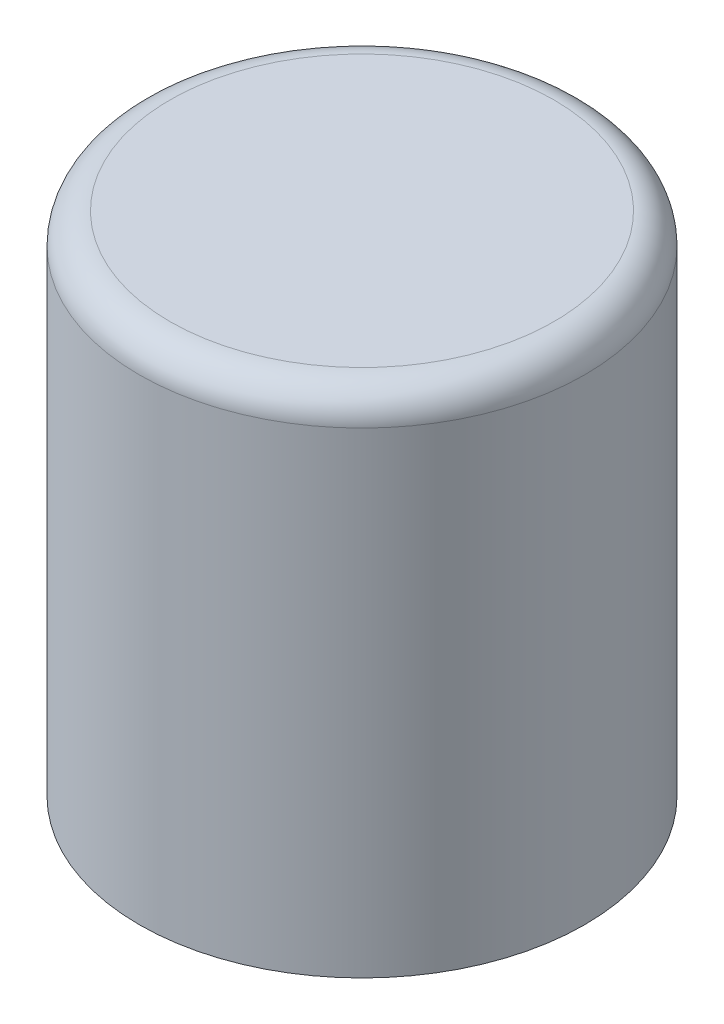
ISO-10303-21;
HEADER;
FILE_DESCRIPTION(('STEP AP214'),'2;1');
FILE_NAME('part.step','',(''),(''),'','','');
FILE_SCHEMA(('AUTOMOTIVE_DESIGN { 1 0 10303 214 1 1 1 1 }'));
ENDSEC;
DATA;
#1=APPLICATION_CONTEXT('core data for automotive mechanical design processes');
#2=APPLICATION_PROTOCOL_DEFINITION('international standard','automotive_design',2000,#1);
#3=PRODUCT_CONTEXT('',#1,'mechanical');
#4=PRODUCT('Part','Part','',(#3));
#5=PRODUCT_RELATED_PRODUCT_CATEGORY('part','',(#4));
#6=PRODUCT_DEFINITION_FORMATION('','',#4);
#7=PRODUCT_DEFINITION_CONTEXT('part definition',#1,'design');
#8=PRODUCT_DEFINITION('design','',#6,#7);
#9=PRODUCT_DEFINITION_SHAPE('','',#8);
#10=(LENGTH_UNIT() NAMED_UNIT(*) SI_UNIT(.MILLI.,.METRE.));
#11=(NAMED_UNIT(*) PLANE_ANGLE_UNIT() SI_UNIT($,.RADIAN.));
#12=(NAMED_UNIT(*) SI_UNIT($,.STERADIAN.) SOLID_ANGLE_UNIT());
#13=UNCERTAINTY_MEASURE_WITH_UNIT(LENGTH_MEASURE(1.E-05),#10,'distance_accuracy_value','');
#14=(GEOMETRIC_REPRESENTATION_CONTEXT(3) GLOBAL_UNCERTAINTY_ASSIGNED_CONTEXT((#13)) GLOBAL_UNIT_ASSIGNED_CONTEXT((#10,
#11,#12)) REPRESENTATION_CONTEXT('',''));
#15=CARTESIAN_POINT('',(0.,0.,0.));
#16=DIRECTION('',(0.,0.,1.));
#17=DIRECTION('',(1.,0.,0.));
#18=AXIS2_PLACEMENT_3D('',#15,#16,#17);
#19=CARTESIAN_POINT('',(0.,0.,0.));
#20=DIRECTION('',(0.,1.,0.));
#21=DIRECTION('',(0.,0.,1.));
#22=AXIS2_PLACEMENT_3D('',#19,#20,#21);
#23=PLANE('',#22);
#24=CARTESIAN_POINT('',(0.,0.,0.));
#25=DIRECTION('',(0.,1.,0.));
#26=DIRECTION('',(0.,0.,1.));
#27=AXIS2_PLACEMENT_3D('',#24,#25,#26);
#28=CIRCLE('',#27,7.25);
#29=CARTESIAN_POINT('',(0.,0.,7.25));
#30=VERTEX_POINT('',#29);
#31=EDGE_CURVE('E46',#30,#30,#28,.T.);
#32=ORIENTED_EDGE('',*,*,#31,.F.);
#33=EDGE_LOOP('',(#32));
#34=FACE_BOUND('',#33,.T.);
#35=CARTESIAN_POINT('',(0.,0.,0.));
#36=DIRECTION('',(0.,1.,0.));
#37=DIRECTION('',(0.,0.,1.));
#38=AXIS2_PLACEMENT_3D('',#35,#36,#37);
#39=CIRCLE('',#38,3.);
#40=CARTESIAN_POINT('',(0.,0.,3.));
#41=VERTEX_POINT('',#40);
#42=EDGE_CURVE('E10',#41,#41,#39,.F.);
#43=ORIENTED_EDGE('',*,*,#42,.F.);
#44=EDGE_LOOP('',(#43));
#45=FACE_BOUND('',#44,.T.);
#46=ADVANCED_FACE('F31',(#34,#45),#23,.F.);
#47=CARTESIAN_POINT('',(0.,16.5,0.));
#48=DIRECTION('',(0.,-1.,0.));
#49=DIRECTION('',(0.,0.,-1.));
#50=AXIS2_PLACEMENT_3D('',#47,#48,#49);
#51=CYLINDRICAL_SURFACE('',#50,7.25);
#52=CARTESIAN_POINT('',(0.,15.5,0.));
#53=DIRECTION('',(0.,1.,0.));
#54=DIRECTION('',(0.,0.,1.));
#55=AXIS2_PLACEMENT_3D('',#52,#53,#54);
#56=CIRCLE('',#55,7.25);
#57=CARTESIAN_POINT('',(0.,15.5,7.25));
#58=VERTEX_POINT('',#57);
#59=EDGE_CURVE('E38',#58,#58,#56,.F.);
#60=ORIENTED_EDGE('',*,*,#59,.T.);
#61=EDGE_LOOP('',(#60));
#62=FACE_BOUND('',#61,.T.);
#63=ORIENTED_EDGE('',*,*,#31,.T.);
#64=EDGE_LOOP('',(#63));
#65=FACE_BOUND('',#64,.T.);
#66=ADVANCED_FACE('F85',(#62,#65),#51,.T.);
#67=CARTESIAN_POINT('',(0.,16.5,0.));
#68=DIRECTION('',(0.,1.,0.));
#69=DIRECTION('',(0.,0.,1.));
#70=AXIS2_PLACEMENT_3D('',#67,#68,#69);
#71=PLANE('',#70);
#72=CARTESIAN_POINT('',(0.,16.5,0.));
#73=DIRECTION('',(0.,1.,0.));
#74=DIRECTION('',(0.,0.,1.));
#75=AXIS2_PLACEMENT_3D('',#72,#73,#74);
#76=CIRCLE('',#75,6.25);
#77=CARTESIAN_POINT('',(0.,16.5,6.25));
#78=VERTEX_POINT('',#77);
#79=EDGE_CURVE('E42',#78,#78,#76,.T.);
#80=ORIENTED_EDGE('',*,*,#79,.T.);
#81=EDGE_LOOP('',(#80));
#82=FACE_BOUND('',#81,.T.);
#83=ADVANCED_FACE('F81',(#82),#71,.T.);
#84=CARTESIAN_POINT('',(0.,15.5,0.));
#85=DIRECTION('',(0.,1.,0.));
#86=DIRECTION('',(0.,0.,1.));
#87=AXIS2_PLACEMENT_3D('',#84,#85,#86);
#88=TOROIDAL_SURFACE('',#87,6.25,1.);
#89=ORIENTED_EDGE('',*,*,#59,.F.);
#90=EDGE_LOOP('',(#89));
#91=FACE_BOUND('',#90,.T.);
#92=ORIENTED_EDGE('',*,*,#79,.F.);
#93=EDGE_LOOP('',(#92));
#94=FACE_BOUND('',#93,.T.);
#95=ADVANCED_FACE('F33',(#91,#94),#88,.T.);
#96=CARTESIAN_POINT('',(0.,-1.,0.));
#97=DIRECTION('',(0.,1.,0.));
#98=DIRECTION('',(0.,0.,1.));
#99=AXIS2_PLACEMENT_3D('',#96,#97,#98);
#100=CYLINDRICAL_SURFACE('',#99,3.);
#101=CARTESIAN_POINT('',(0.,-1.,0.));
#102=DIRECTION('',(0.,-1.,0.));
#103=DIRECTION('',(0.,0.,-1.));
#104=AXIS2_PLACEMENT_3D('',#101,#102,#103);
#105=CIRCLE('',#104,3.);
#106=CARTESIAN_POINT('',(0.,-1.,-3.));
#107=VERTEX_POINT('',#106);
#108=EDGE_CURVE('E51',#107,#107,#105,.T.);
#109=ORIENTED_EDGE('',*,*,#108,.F.);
#110=EDGE_LOOP('',(#109));
#111=FACE_BOUND('',#110,.T.);
#112=ORIENTED_EDGE('',*,*,#42,.T.);
#113=EDGE_LOOP('',(#112));
#114=FACE_BOUND('',#113,.T.);
#115=ADVANCED_FACE('F72',(#111,#114),#100,.T.);
#116=CARTESIAN_POINT('',(0.,-1.,0.));
#117=DIRECTION('',(0.,-1.,0.));
#118=DIRECTION('',(0.,0.,-1.));
#119=AXIS2_PLACEMENT_3D('',#116,#117,#118);
#120=PLANE('',#119);
#121=CARTESIAN_POINT('',(0.,-1.,0.));
#122=DIRECTION('',(0.,-1.,0.));
#123=DIRECTION('',(0.,0.,-1.));
#124=AXIS2_PLACEMENT_3D('',#121,#122,#123);
#125=CIRCLE('',#124,0.295);
#126=CARTESIAN_POINT('',(0.,-1.,-0.295));
#127=VERTEX_POINT('',#126);
#128=EDGE_CURVE('E55',#127,#127,#125,.T.);
#129=ORIENTED_EDGE('',*,*,#128,.F.);
#130=EDGE_LOOP('',(#129));
#131=FACE_BOUND('',#130,.T.);
#132=ORIENTED_EDGE('',*,*,#108,.T.);
#133=EDGE_LOOP('',(#132));
#134=FACE_BOUND('',#133,.T.);
#135=ADVANCED_FACE('F66',(#131,#134),#120,.T.);
#136=CARTESIAN_POINT('',(0.,9.,0.));
#137=DIRECTION('',(0.,-1.,0.));
#138=DIRECTION('',(0.,0.,-1.));
#139=AXIS2_PLACEMENT_3D('',#136,#137,#138);
#140=CYLINDRICAL_SURFACE('',#139,0.295);
#141=CARTESIAN_POINT('',(0.,9.,0.));
#142=DIRECTION('',(0.,-1.,0.));
#143=DIRECTION('',(0.,0.,-1.));
#144=AXIS2_PLACEMENT_3D('',#141,#142,#143);
#145=CIRCLE('',#144,0.295);
#146=CARTESIAN_POINT('',(0.,9.,-0.295));
#147=VERTEX_POINT('',#146);
#148=EDGE_CURVE('E54',#147,#147,#145,.T.);
#149=ORIENTED_EDGE('',*,*,#148,.F.);
#150=EDGE_LOOP('',(#149));
#151=FACE_BOUND('',#150,.T.);
#152=ORIENTED_EDGE('',*,*,#128,.T.);
#153=EDGE_LOOP('',(#152));
#154=FACE_BOUND('',#153,.T.);
#155=ADVANCED_FACE('F63',(#151,#154),#140,.F.);
#156=CARTESIAN_POINT('',(0.,9.,0.));
#157=DIRECTION('',(0.,-1.,0.));
#158=DIRECTION('',(0.,0.,-1.));
#159=AXIS2_PLACEMENT_3D('',#156,#157,#158);
#160=PLANE('',#159);
#161=ORIENTED_EDGE('',*,*,#148,.T.);
#162=EDGE_LOOP('',(#161));
#163=FACE_BOUND('',#162,.T.);
#164=ADVANCED_FACE('F61',(#163),#160,.T.);
#165=CLOSED_SHELL('',(#46,#66,#83,#95,#115,#135,#155,#164));
#166=MANIFOLD_SOLID_BREP('B2',#165);
#167=ADVANCED_BREP_SHAPE_REPRESENTATION('',(#18,#166),#14);
#168=SHAPE_DEFINITION_REPRESENTATION(#9,#167);
ENDSEC;
END-ISO-10303-21;
